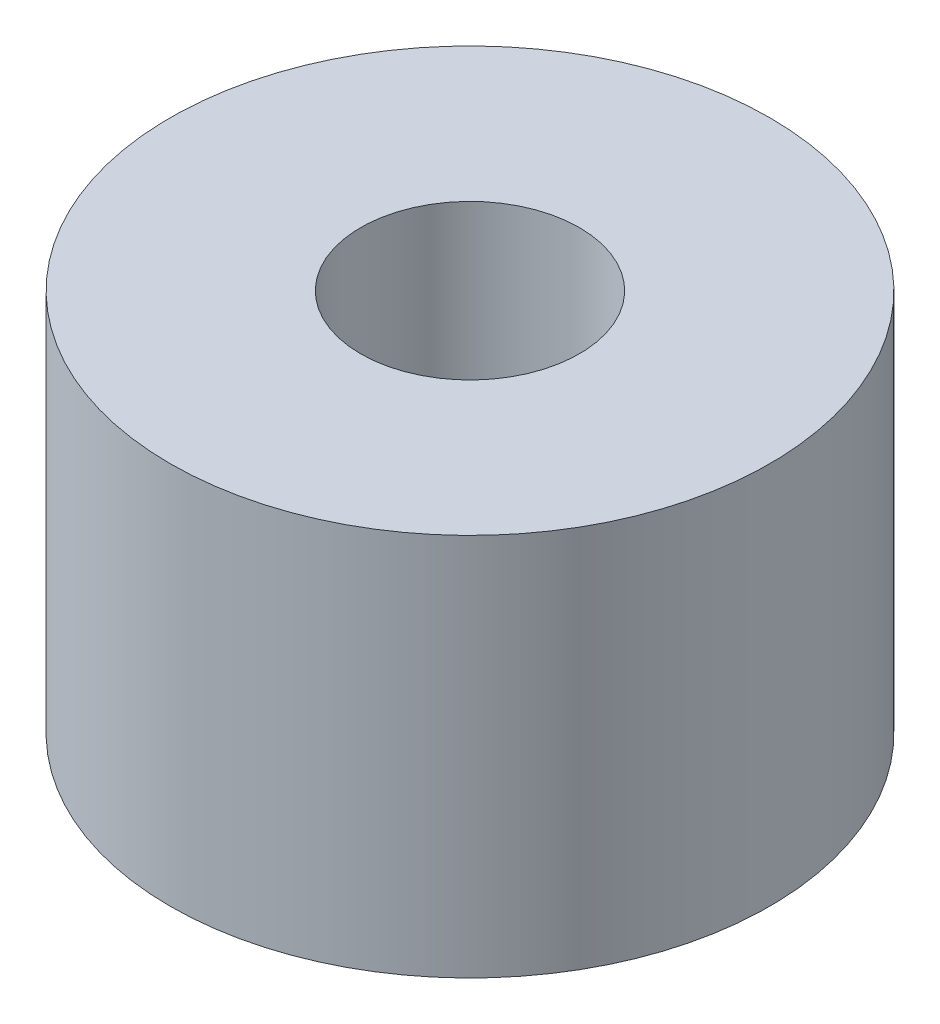
ISO-10303-21;
HEADER;
FILE_DESCRIPTION(('STEP AP214'),'2;1');
FILE_NAME('part.step','',(''),(''),'','','');
FILE_SCHEMA(('AUTOMOTIVE_DESIGN { 1 0 10303 214 1 1 1 1 }'));
ENDSEC;
DATA;
#1=APPLICATION_CONTEXT('core data for automotive mechanical design processes');
#2=APPLICATION_PROTOCOL_DEFINITION('international standard','automotive_design',2000,#1);
#3=PRODUCT_CONTEXT('',#1,'mechanical');
#4=PRODUCT('Part','Part','',(#3));
#5=PRODUCT_RELATED_PRODUCT_CATEGORY('part','',(#4));
#6=PRODUCT_DEFINITION_FORMATION('','',#4);
#7=PRODUCT_DEFINITION_CONTEXT('part definition',#1,'design');
#8=PRODUCT_DEFINITION('design','',#6,#7);
#9=PRODUCT_DEFINITION_SHAPE('','',#8);
#10=(LENGTH_UNIT() NAMED_UNIT(*) SI_UNIT(.MILLI.,.METRE.));
#11=(NAMED_UNIT(*) PLANE_ANGLE_UNIT() SI_UNIT($,.RADIAN.));
#12=(NAMED_UNIT(*) SI_UNIT($,.STERADIAN.) SOLID_ANGLE_UNIT());
#13=UNCERTAINTY_MEASURE_WITH_UNIT(LENGTH_MEASURE(1.E-05),#10,'distance_accuracy_value','');
#14=(GEOMETRIC_REPRESENTATION_CONTEXT(3) GLOBAL_UNCERTAINTY_ASSIGNED_CONTEXT((#13)) GLOBAL_UNIT_ASSIGNED_CONTEXT((#10,
#11,#12)) REPRESENTATION_CONTEXT('',''));
#15=CARTESIAN_POINT('',(0.,0.,0.));
#16=DIRECTION('',(0.,0.,1.));
#17=DIRECTION('',(1.,0.,0.));
#18=AXIS2_PLACEMENT_3D('',#15,#16,#17);
#19=CARTESIAN_POINT('',(0.,11.1252,0.));
#20=DIRECTION('',(0.,1.,0.));
#21=DIRECTION('',(0.,0.,1.));
#22=AXIS2_PLACEMENT_3D('',#19,#20,#21);
#23=PLANE('',#22);
#24=CARTESIAN_POINT('',(0.,11.1252,0.));
#25=DIRECTION('',(0.,1.,0.));
#26=DIRECTION('',(0.,0.,1.));
#27=AXIS2_PLACEMENT_3D('',#24,#25,#26);
#28=CIRCLE('',#27,8.6995);
#29=CARTESIAN_POINT('',(0.,11.1252,-8.6995));
#30=VERTEX_POINT('',#29);
#31=EDGE_CURVE('E10',#30,#30,#28,.T.);
#32=ORIENTED_EDGE('',*,*,#31,.T.);
#33=EDGE_LOOP('',(#32));
#34=FACE_BOUND('',#33,.T.);
#35=CARTESIAN_POINT('',(0.,11.1252,0.));
#36=DIRECTION('',(0.,1.,0.));
#37=DIRECTION('',(0.,0.,1.));
#38=AXIS2_PLACEMENT_3D('',#35,#36,#37);
#39=CIRCLE('',#38,3.175);
#40=CARTESIAN_POINT('',(0.,11.1252,-3.175));
#41=VERTEX_POINT('',#40);
#42=EDGE_CURVE('E42',#41,#41,#39,.T.);
#43=ORIENTED_EDGE('',*,*,#42,.F.);
#44=EDGE_LOOP('',(#43));
#45=FACE_BOUND('',#44,.T.);
#46=ADVANCED_FACE('F31',(#34,#45),#23,.T.);
#47=CARTESIAN_POINT('',(0.,0.,0.));
#48=DIRECTION('',(0.,1.,0.));
#49=DIRECTION('',(0.,0.,1.));
#50=AXIS2_PLACEMENT_3D('',#47,#48,#49);
#51=PLANE('',#50);
#52=CARTESIAN_POINT('',(0.,0.,0.));
#53=DIRECTION('',(0.,1.,0.));
#54=DIRECTION('',(0.,0.,1.));
#55=AXIS2_PLACEMENT_3D('',#52,#53,#54);
#56=CIRCLE('',#55,8.6995);
#57=CARTESIAN_POINT('',(0.,0.,-8.6995));
#58=VERTEX_POINT('',#57);
#59=EDGE_CURVE('E35',#58,#58,#56,.T.);
#60=ORIENTED_EDGE('',*,*,#59,.F.);
#61=EDGE_LOOP('',(#60));
#62=FACE_BOUND('',#61,.T.);
#63=CARTESIAN_POINT('',(0.,0.,0.));
#64=DIRECTION('',(0.,1.,0.));
#65=DIRECTION('',(0.,0.,1.));
#66=AXIS2_PLACEMENT_3D('',#63,#64,#65);
#67=CIRCLE('',#66,3.175);
#68=CARTESIAN_POINT('',(0.,0.,-3.175));
#69=VERTEX_POINT('',#68);
#70=EDGE_CURVE('E44',#69,#69,#67,.T.);
#71=ORIENTED_EDGE('',*,*,#70,.T.);
#72=EDGE_LOOP('',(#71));
#73=FACE_BOUND('',#72,.T.);
#74=ADVANCED_FACE('F54',(#62,#73),#51,.F.);
#75=CARTESIAN_POINT('',(0.,11.1252,0.));
#76=DIRECTION('',(0.,-1.,0.));
#77=DIRECTION('',(0.,0.,-1.));
#78=AXIS2_PLACEMENT_3D('',#75,#76,#77);
#79=CYLINDRICAL_SURFACE('',#78,8.6995);
#80=CARTESIAN_POINT('',(0.,11.1252,-8.6995));
#81=CARTESIAN_POINT('',(0.,11.0093125,-8.6995));
#82=CARTESIAN_POINT('',(0.,10.893425,-8.6995));
#83=CARTESIAN_POINT('',(0.,10.66165,-8.6995));
#84=CARTESIAN_POINT('',(0.,10.5457625,-8.6995));
#85=CARTESIAN_POINT('',(0.,10.3139875,-8.6995));
#86=CARTESIAN_POINT('',(0.,10.1981,-8.6995));
#87=CARTESIAN_POINT('',(0.,9.966325,-8.6995));
#88=CARTESIAN_POINT('',(0.,9.8504375,-8.6995));
#89=CARTESIAN_POINT('',(0.,9.6186625,-8.6995));
#90=CARTESIAN_POINT('',(0.,9.502775,-8.6995));
#91=CARTESIAN_POINT('',(0.,9.271,-8.6995));
#92=CARTESIAN_POINT('',(0.,9.1551125,-8.6995));
#93=CARTESIAN_POINT('',(0.,8.9233375,-8.6995));
#94=CARTESIAN_POINT('',(0.,8.80745,-8.6995));
#95=CARTESIAN_POINT('',(0.,8.575675,-8.6995));
#96=CARTESIAN_POINT('',(0.,8.4597875,-8.6995));
#97=CARTESIAN_POINT('',(0.,8.2280125,-8.6995));
#98=CARTESIAN_POINT('',(0.,8.112125,-8.6995));
#99=CARTESIAN_POINT('',(0.,7.88035,-8.6995));
#100=CARTESIAN_POINT('',(0.,7.7644625,-8.6995));
#101=CARTESIAN_POINT('',(0.,7.5326875,-8.6995));
#102=CARTESIAN_POINT('',(0.,7.4168,-8.6995));
#103=CARTESIAN_POINT('',(0.,7.185025,-8.6995));
#104=CARTESIAN_POINT('',(0.,7.0691375,-8.6995));
#105=CARTESIAN_POINT('',(0.,6.8373625,-8.6995));
#106=CARTESIAN_POINT('',(0.,6.721475,-8.6995));
#107=CARTESIAN_POINT('',(0.,6.4897,-8.6995));
#108=CARTESIAN_POINT('',(0.,6.3738125,-8.6995));
#109=CARTESIAN_POINT('',(0.,6.1420375,-8.6995));
#110=CARTESIAN_POINT('',(0.,6.02615,-8.6995));
#111=CARTESIAN_POINT('',(0.,5.794375,-8.6995));
#112=CARTESIAN_POINT('',(0.,5.6784875,-8.6995));
#113=CARTESIAN_POINT('',(0.,5.4467125,-8.6995));
#114=CARTESIAN_POINT('',(0.,5.330825,-8.6995));
#115=CARTESIAN_POINT('',(0.,5.09905,-8.6995));
#116=CARTESIAN_POINT('',(0.,4.9831625,-8.6995));
#117=CARTESIAN_POINT('',(0.,4.7513875,-8.6995));
#118=CARTESIAN_POINT('',(0.,4.6355,-8.6995));
#119=CARTESIAN_POINT('',(0.,4.403725,-8.6995));
#120=CARTESIAN_POINT('',(0.,4.2878375,-8.6995));
#121=CARTESIAN_POINT('',(0.,4.0560625,-8.6995));
#122=CARTESIAN_POINT('',(0.,3.940175,-8.6995));
#123=CARTESIAN_POINT('',(0.,3.7084,-8.6995));
#124=CARTESIAN_POINT('',(0.,3.5925125,-8.6995));
#125=CARTESIAN_POINT('',(0.,3.3607375,-8.6995));
#126=CARTESIAN_POINT('',(0.,3.24485,-8.6995));
#127=CARTESIAN_POINT('',(0.,3.013075,-8.6995));
#128=CARTESIAN_POINT('',(0.,2.8971875,-8.6995));
#129=CARTESIAN_POINT('',(0.,2.6654125,-8.6995));
#130=CARTESIAN_POINT('',(0.,2.549525,-8.6995));
#131=CARTESIAN_POINT('',(0.,2.31775,-8.6995));
#132=CARTESIAN_POINT('',(0.,2.2018625,-8.6995));
#133=CARTESIAN_POINT('',(0.,1.9700875,-8.6995));
#134=CARTESIAN_POINT('',(0.,1.8542,-8.6995));
#135=CARTESIAN_POINT('',(0.,1.622425,-8.6995));
#136=CARTESIAN_POINT('',(0.,1.5065375,-8.6995));
#137=CARTESIAN_POINT('',(0.,1.2747625,-8.6995));
#138=CARTESIAN_POINT('',(0.,1.158875,-8.6995));
#139=CARTESIAN_POINT('',(0.,0.9271,-8.6995));
#140=CARTESIAN_POINT('',(0.,0.8112125,-8.6995));
#141=CARTESIAN_POINT('',(0.,0.5794375,-8.6995));
#142=CARTESIAN_POINT('',(0.,0.46355,-8.6995));
#143=CARTESIAN_POINT('',(0.,0.231775,-8.6995));
#144=CARTESIAN_POINT('',(0.,0.1158875,-8.6995));
#145=CARTESIAN_POINT('',(0.,0.,-8.6995));
#146=B_SPLINE_CURVE_WITH_KNOTS('',3,(#80,#81,#82,#83,#84,#85,#86,#87,#88,#89,#90,#91,#92,#93,
#94,#95,#96,#97,#98,#99,#100,#101,#102,#103,#104,#105,#106,#107,#108,#109,#110,#111,#112,#113,
#114,#115,#116,#117,#118,#119,#120,#121,#122,#123,#124,#125,#126,#127,#128,#129,#130,#131,#132,
#133,#134,#135,#136,#137,#138,#139,#140,#141,#142,#143,#144,#145),.UNSPECIFIED.,.F.,.F.,(4,2,2,
2,2,2,2,2,2,2,2,2,2,2,2,2,2,2,2,2,2,2,2,2,2,2,2,2,2,2,2,2,4),(0.,0.347662499999998,
0.695324999999998,1.0429875,1.39065,1.7383125,2.085975,2.4336375,2.7813,3.1289625,3.476625,
3.8242875,4.17195,4.5196125,4.867275,5.2149375,5.5626,5.9102625,6.257925,6.6055875,6.95325,
7.3009125,7.648575,7.9962375,8.3439,8.6915625,9.039225,9.3868875,9.73455,10.0822125,10.429875,
10.7775375,11.1252),.UNSPECIFIED.);
#147=EDGE_CURVE('BSEAM33',#30,#58,#146,.T.);
#148=ORIENTED_EDGE('',*,*,#31,.F.);
#149=ORIENTED_EDGE('',*,*,#59,.T.);
#150=ORIENTED_EDGE('',*,*,#147,.T.);
#151=ORIENTED_EDGE('',*,*,#147,.F.);
#152=EDGE_LOOP('',(#148,#150,#149,#151));
#153=FACE_BOUND('',#152,.T.);
#154=ADVANCED_FACE('F33',(#153),#79,.T.);
#155=CARTESIAN_POINT('',(0.,11.1252,0.));
#156=DIRECTION('',(0.,-1.,0.));
#157=DIRECTION('',(0.,0.,-1.));
#158=AXIS2_PLACEMENT_3D('',#155,#156,#157);
#159=CYLINDRICAL_SURFACE('',#158,3.175);
#160=CARTESIAN_POINT('',(0.,11.1252,-3.175));
#161=CARTESIAN_POINT('',(0.,11.0093125,-3.175));
#162=CARTESIAN_POINT('',(0.,10.893425,-3.175));
#163=CARTESIAN_POINT('',(0.,10.66165,-3.175));
#164=CARTESIAN_POINT('',(0.,10.5457625,-3.175));
#165=CARTESIAN_POINT('',(0.,10.3139875,-3.175));
#166=CARTESIAN_POINT('',(0.,10.1981,-3.175));
#167=CARTESIAN_POINT('',(0.,9.966325,-3.175));
#168=CARTESIAN_POINT('',(0.,9.8504375,-3.175));
#169=CARTESIAN_POINT('',(0.,9.6186625,-3.175));
#170=CARTESIAN_POINT('',(0.,9.502775,-3.175));
#171=CARTESIAN_POINT('',(0.,9.271,-3.175));
#172=CARTESIAN_POINT('',(0.,9.1551125,-3.175));
#173=CARTESIAN_POINT('',(0.,8.9233375,-3.175));
#174=CARTESIAN_POINT('',(0.,8.80745,-3.175));
#175=CARTESIAN_POINT('',(0.,8.575675,-3.175));
#176=CARTESIAN_POINT('',(0.,8.4597875,-3.175));
#177=CARTESIAN_POINT('',(0.,8.2280125,-3.175));
#178=CARTESIAN_POINT('',(0.,8.112125,-3.175));
#179=CARTESIAN_POINT('',(0.,7.88035,-3.175));
#180=CARTESIAN_POINT('',(0.,7.7644625,-3.175));
#181=CARTESIAN_POINT('',(0.,7.5326875,-3.175));
#182=CARTESIAN_POINT('',(0.,7.4168,-3.175));
#183=CARTESIAN_POINT('',(0.,7.185025,-3.175));
#184=CARTESIAN_POINT('',(0.,7.0691375,-3.175));
#185=CARTESIAN_POINT('',(0.,6.8373625,-3.175));
#186=CARTESIAN_POINT('',(0.,6.721475,-3.175));
#187=CARTESIAN_POINT('',(0.,6.4897,-3.175));
#188=CARTESIAN_POINT('',(0.,6.3738125,-3.175));
#189=CARTESIAN_POINT('',(0.,6.1420375,-3.175));
#190=CARTESIAN_POINT('',(0.,6.02615,-3.175));
#191=CARTESIAN_POINT('',(0.,5.794375,-3.175));
#192=CARTESIAN_POINT('',(0.,5.6784875,-3.175));
#193=CARTESIAN_POINT('',(0.,5.4467125,-3.175));
#194=CARTESIAN_POINT('',(0.,5.330825,-3.175));
#195=CARTESIAN_POINT('',(0.,5.09905,-3.175));
#196=CARTESIAN_POINT('',(0.,4.9831625,-3.175));
#197=CARTESIAN_POINT('',(0.,4.7513875,-3.175));
#198=CARTESIAN_POINT('',(0.,4.6355,-3.175));
#199=CARTESIAN_POINT('',(0.,4.403725,-3.175));
#200=CARTESIAN_POINT('',(0.,4.2878375,-3.175));
#201=CARTESIAN_POINT('',(0.,4.0560625,-3.175));
#202=CARTESIAN_POINT('',(0.,3.940175,-3.175));
#203=CARTESIAN_POINT('',(0.,3.7084,-3.175));
#204=CARTESIAN_POINT('',(0.,3.5925125,-3.175));
#205=CARTESIAN_POINT('',(0.,3.3607375,-3.175));
#206=CARTESIAN_POINT('',(0.,3.24485,-3.175));
#207=CARTESIAN_POINT('',(0.,3.013075,-3.175));
#208=CARTESIAN_POINT('',(0.,2.8971875,-3.175));
#209=CARTESIAN_POINT('',(0.,2.6654125,-3.175));
#210=CARTESIAN_POINT('',(0.,2.549525,-3.175));
#211=CARTESIAN_POINT('',(0.,2.31775,-3.175));
#212=CARTESIAN_POINT('',(0.,2.2018625,-3.175));
#213=CARTESIAN_POINT('',(0.,1.9700875,-3.175));
#214=CARTESIAN_POINT('',(0.,1.8542,-3.175));
#215=CARTESIAN_POINT('',(0.,1.622425,-3.175));
#216=CARTESIAN_POINT('',(0.,1.5065375,-3.175));
#217=CARTESIAN_POINT('',(0.,1.2747625,-3.175));
#218=CARTESIAN_POINT('',(0.,1.158875,-3.175));
#219=CARTESIAN_POINT('',(0.,0.9271,-3.175));
#220=CARTESIAN_POINT('',(0.,0.8112125,-3.175));
#221=CARTESIAN_POINT('',(0.,0.5794375,-3.175));
#222=CARTESIAN_POINT('',(0.,0.46355,-3.175));
#223=CARTESIAN_POINT('',(0.,0.231775,-3.175));
#224=CARTESIAN_POINT('',(0.,0.1158875,-3.175));
#225=CARTESIAN_POINT('',(0.,0.,-3.175));
#226=B_SPLINE_CURVE_WITH_KNOTS('',3,(#160,#161,#162,#163,#164,#165,#166,#167,#168,#169,#170,
#171,#172,#173,#174,#175,#176,#177,#178,#179,#180,#181,#182,#183,#184,#185,#186,#187,#188,#189,
#190,#191,#192,#193,#194,#195,#196,#197,#198,#199,#200,#201,#202,#203,#204,#205,#206,#207,#208,
#209,#210,#211,#212,#213,#214,#215,#216,#217,#218,#219,#220,#221,#222,#223,#224,#225),
.UNSPECIFIED.,.F.,.F.,(4,2,2,2,2,2,2,2,2,2,2,2,2,2,2,2,2,2,2,2,2,2,2,2,2,2,2,2,2,2,2,2,4),(0.,
0.3476625,0.695325,1.0429875,1.39065,1.7383125,2.085975,2.4336375,2.7813,3.1289625,3.476625,
3.8242875,4.17195,4.5196125,4.867275,5.2149375,5.5626,5.9102625,6.257925,6.6055875,6.95325,
7.3009125,7.648575,7.9962375,8.3439,8.6915625,9.039225,9.3868875,9.73455,10.0822125,10.429875,
10.7775375,11.1252),.UNSPECIFIED.);
#227=EDGE_CURVE('BSEAM50',#41,#69,#226,.T.);
#228=ORIENTED_EDGE('',*,*,#42,.T.);
#229=ORIENTED_EDGE('',*,*,#70,.F.);
#230=ORIENTED_EDGE('',*,*,#227,.T.);
#231=ORIENTED_EDGE('',*,*,#227,.F.);
#232=EDGE_LOOP('',(#228,#230,#229,#231));
#233=FACE_BOUND('',#232,.T.);
#234=ADVANCED_FACE('F50',(#233),#159,.F.);
#235=CLOSED_SHELL('',(#46,#74,#154,#234));
#236=MANIFOLD_SOLID_BREP('B2',#235);
#237=ADVANCED_BREP_SHAPE_REPRESENTATION('',(#18,#236),#14);
#238=SHAPE_DEFINITION_REPRESENTATION(#9,#237);
ENDSEC;
END-ISO-10303-21;
